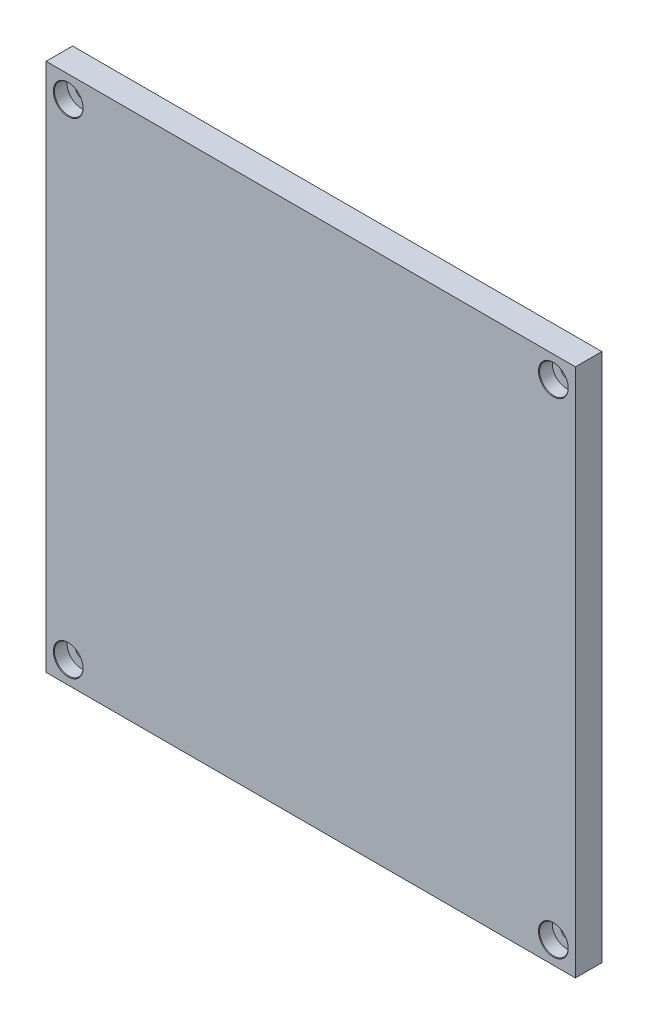
ISO-10303-21;
HEADER;
FILE_DESCRIPTION(('STEP AP214'),'2;1');
FILE_NAME('part.step','',(''),(''),'','','');
FILE_SCHEMA(('AUTOMOTIVE_DESIGN { 1 0 10303 214 1 1 1 1 }'));
ENDSEC;
DATA;
#1=APPLICATION_CONTEXT('core data for automotive mechanical design processes');
#2=APPLICATION_PROTOCOL_DEFINITION('international standard','automotive_design',2000,#1);
#3=PRODUCT_CONTEXT('',#1,'mechanical');
#4=PRODUCT('Part','Part','',(#3));
#5=PRODUCT_RELATED_PRODUCT_CATEGORY('part','',(#4));
#6=PRODUCT_DEFINITION_FORMATION('','',#4);
#7=PRODUCT_DEFINITION_CONTEXT('part definition',#1,'design');
#8=PRODUCT_DEFINITION('design','',#6,#7);
#9=PRODUCT_DEFINITION_SHAPE('','',#8);
#10=(LENGTH_UNIT() NAMED_UNIT(*) SI_UNIT(.MILLI.,.METRE.));
#11=(NAMED_UNIT(*) PLANE_ANGLE_UNIT() SI_UNIT($,.RADIAN.));
#12=(NAMED_UNIT(*) SI_UNIT($,.STERADIAN.) SOLID_ANGLE_UNIT());
#13=UNCERTAINTY_MEASURE_WITH_UNIT(LENGTH_MEASURE(1.E-05),#10,'distance_accuracy_value','');
#14=(GEOMETRIC_REPRESENTATION_CONTEXT(3) GLOBAL_UNCERTAINTY_ASSIGNED_CONTEXT((#13)) GLOBAL_UNIT_ASSIGNED_CONTEXT((#10,
#11,#12)) REPRESENTATION_CONTEXT('',''));
#15=CARTESIAN_POINT('',(0.,0.,0.));
#16=DIRECTION('',(0.,0.,1.));
#17=DIRECTION('',(1.,0.,0.));
#18=AXIS2_PLACEMENT_3D('',#15,#16,#17);
#19=CARTESIAN_POINT('',(60.,60.,6.));
#20=DIRECTION('',(0.,-1.,0.));
#21=DIRECTION('',(0.,0.,-1.));
#22=AXIS2_PLACEMENT_3D('',#19,#20,#21);
#23=PLANE('',#22);
#24=DIRECTION('',(-1.,0.,0.));
#25=VECTOR('',#24,1.);
#26=CARTESIAN_POINT('',(60.,60.,0.));
#27=LINE('',#26,#25);
#28=CARTESIAN_POINT('',(60.,60.,0.));
#29=VERTEX_POINT('',#28);
#30=CARTESIAN_POINT('',(-60.,60.,0.));
#31=VERTEX_POINT('',#30);
#32=EDGE_CURVE('E113',#29,#31,#27,.T.);
#33=ORIENTED_EDGE('',*,*,#32,.T.);
#34=DIRECTION('',(0.,0.,-1.));
#35=VECTOR('',#34,1.);
#36=CARTESIAN_POINT('',(-60.,60.,6.));
#37=LINE('',#36,#35);
#38=CARTESIAN_POINT('',(-60.,60.,6.));
#39=VERTEX_POINT('',#38);
#40=EDGE_CURVE('E11',#39,#31,#37,.T.);
#41=ORIENTED_EDGE('',*,*,#40,.F.);
#42=DIRECTION('',(-1.,0.,0.));
#43=VECTOR('',#42,1.);
#44=CARTESIAN_POINT('',(60.,60.,6.));
#45=LINE('',#44,#43);
#46=CARTESIAN_POINT('',(60.,60.,6.));
#47=VERTEX_POINT('',#46);
#48=EDGE_CURVE('E97',#47,#39,#45,.T.);
#49=ORIENTED_EDGE('',*,*,#48,.F.);
#50=DIRECTION('',(0.,0.,-1.));
#51=VECTOR('',#50,1.);
#52=CARTESIAN_POINT('',(60.,60.,6.));
#53=LINE('',#52,#51);
#54=EDGE_CURVE('E107',#47,#29,#53,.T.);
#55=ORIENTED_EDGE('',*,*,#54,.T.);
#56=EDGE_LOOP('',(#33,#41,#49,#55));
#57=FACE_BOUND('',#56,.T.);
#58=ADVANCED_FACE('F44',(#57),#23,.F.);
#59=CARTESIAN_POINT('',(-60.,-60.,6.));
#60=DIRECTION('',(1.,0.,0.));
#61=DIRECTION('',(0.,0.,-1.));
#62=AXIS2_PLACEMENT_3D('',#59,#60,#61);
#63=PLANE('',#62);
#64=DIRECTION('',(0.,-1.,0.));
#65=VECTOR('',#64,1.);
#66=CARTESIAN_POINT('',(-60.,-60.,0.));
#67=LINE('',#66,#65);
#68=CARTESIAN_POINT('',(-60.,-60.,0.));
#69=VERTEX_POINT('',#68);
#70=EDGE_CURVE('E105',#31,#69,#67,.T.);
#71=ORIENTED_EDGE('',*,*,#70,.T.);
#72=DIRECTION('',(0.,0.,-1.));
#73=VECTOR('',#72,1.);
#74=CARTESIAN_POINT('',(-60.,-60.,6.));
#75=LINE('',#74,#73);
#76=CARTESIAN_POINT('',(-60.,-60.,6.));
#77=VERTEX_POINT('',#76);
#78=EDGE_CURVE('E53',#77,#69,#75,.T.);
#79=ORIENTED_EDGE('',*,*,#78,.F.);
#80=DIRECTION('',(0.,-1.,0.));
#81=VECTOR('',#80,1.);
#82=CARTESIAN_POINT('',(-60.,-60.,6.));
#83=LINE('',#82,#81);
#84=EDGE_CURVE('E95',#39,#77,#83,.T.);
#85=ORIENTED_EDGE('',*,*,#84,.F.);
#86=ORIENTED_EDGE('',*,*,#40,.T.);
#87=EDGE_LOOP('',(#71,#79,#85,#86));
#88=FACE_BOUND('',#87,.T.);
#89=ADVANCED_FACE('F103',(#88),#63,.F.);
#90=CARTESIAN_POINT('',(60.,-60.,6.));
#91=DIRECTION('',(0.,1.,0.));
#92=DIRECTION('',(0.,0.,1.));
#93=AXIS2_PLACEMENT_3D('',#90,#91,#92);
#94=PLANE('',#93);
#95=DIRECTION('',(1.,0.,0.));
#96=VECTOR('',#95,1.);
#97=CARTESIAN_POINT('',(60.,-60.,0.));
#98=LINE('',#97,#96);
#99=CARTESIAN_POINT('',(60.,-60.,0.));
#100=VERTEX_POINT('',#99);
#101=EDGE_CURVE('E79',#69,#100,#98,.T.);
#102=ORIENTED_EDGE('',*,*,#101,.T.);
#103=DIRECTION('',(0.,0.,-1.));
#104=VECTOR('',#103,1.);
#105=CARTESIAN_POINT('',(60.,-60.,6.));
#106=LINE('',#105,#104);
#107=CARTESIAN_POINT('',(60.,-60.,6.));
#108=VERTEX_POINT('',#107);
#109=EDGE_CURVE('E104',#108,#100,#106,.T.);
#110=ORIENTED_EDGE('',*,*,#109,.F.);
#111=DIRECTION('',(1.,0.,0.));
#112=VECTOR('',#111,1.);
#113=CARTESIAN_POINT('',(60.,-60.,6.));
#114=LINE('',#113,#112);
#115=EDGE_CURVE('E93',#77,#108,#114,.T.);
#116=ORIENTED_EDGE('',*,*,#115,.F.);
#117=ORIENTED_EDGE('',*,*,#78,.T.);
#118=EDGE_LOOP('',(#102,#110,#116,#117));
#119=FACE_BOUND('',#118,.T.);
#120=ADVANCED_FACE('F102',(#119),#94,.F.);
#121=CARTESIAN_POINT('',(60.,-60.,6.));
#122=DIRECTION('',(-1.,0.,0.));
#123=DIRECTION('',(0.,0.,1.));
#124=AXIS2_PLACEMENT_3D('',#121,#122,#123);
#125=PLANE('',#124);
#126=DIRECTION('',(0.,1.,0.));
#127=VECTOR('',#126,1.);
#128=CARTESIAN_POINT('',(60.,-60.,0.));
#129=LINE('',#128,#127);
#130=EDGE_CURVE('E83',#100,#29,#129,.T.);
#131=ORIENTED_EDGE('',*,*,#130,.T.);
#132=ORIENTED_EDGE('',*,*,#54,.F.);
#133=DIRECTION('',(0.,1.,0.));
#134=VECTOR('',#133,1.);
#135=CARTESIAN_POINT('',(60.,-60.,6.));
#136=LINE('',#135,#134);
#137=EDGE_CURVE('E65',#108,#47,#136,.T.);
#138=ORIENTED_EDGE('',*,*,#137,.F.);
#139=ORIENTED_EDGE('',*,*,#109,.T.);
#140=EDGE_LOOP('',(#131,#132,#138,#139));
#141=FACE_BOUND('',#140,.T.);
#142=ADVANCED_FACE('F130',(#141),#125,.F.);
#143=CARTESIAN_POINT('',(0.,0.,6.));
#144=DIRECTION('',(0.,0.,-1.));
#145=DIRECTION('',(-1.,0.,0.));
#146=AXIS2_PLACEMENT_3D('',#143,#144,#145);
#147=PLANE('',#146);
#148=CARTESIAN_POINT('',(55.,-55.,6.));
#149=DIRECTION('',(0.,0.,1.));
#150=DIRECTION('',(1.,0.,0.));
#151=AXIS2_PLACEMENT_3D('',#148,#149,#150);
#152=CIRCLE('',#151,3.375);
#153=CARTESIAN_POINT('',(58.375,-55.,6.));
#154=VERTEX_POINT('',#153);
#155=EDGE_CURVE('E209',#154,#154,#152,.T.);
#156=ORIENTED_EDGE('',*,*,#155,.F.);
#157=EDGE_LOOP('',(#156));
#158=FACE_BOUND('',#157,.T.);
#159=CARTESIAN_POINT('',(55.,55.,6.));
#160=DIRECTION('',(0.,0.,1.));
#161=DIRECTION('',(1.,0.,0.));
#162=AXIS2_PLACEMENT_3D('',#159,#160,#161);
#163=CIRCLE('',#162,3.375);
#164=CARTESIAN_POINT('',(58.375,55.,6.));
#165=VERTEX_POINT('',#164);
#166=EDGE_CURVE('E186',#165,#165,#163,.T.);
#167=ORIENTED_EDGE('',*,*,#166,.F.);
#168=EDGE_LOOP('',(#167));
#169=FACE_BOUND('',#168,.T.);
#170=CARTESIAN_POINT('',(-55.,-55.,6.));
#171=DIRECTION('',(0.,0.,1.));
#172=DIRECTION('',(1.,0.,0.));
#173=AXIS2_PLACEMENT_3D('',#170,#171,#172);
#174=CIRCLE('',#173,3.375);
#175=CARTESIAN_POINT('',(-51.625,-55.,6.));
#176=VERTEX_POINT('',#175);
#177=EDGE_CURVE('E169',#176,#176,#174,.T.);
#178=ORIENTED_EDGE('',*,*,#177,.F.);
#179=EDGE_LOOP('',(#178));
#180=FACE_BOUND('',#179,.T.);
#181=CARTESIAN_POINT('',(-55.,55.,6.));
#182=DIRECTION('',(0.,0.,1.));
#183=DIRECTION('',(1.,0.,0.));
#184=AXIS2_PLACEMENT_3D('',#181,#182,#183);
#185=CIRCLE('',#184,3.375);
#186=CARTESIAN_POINT('',(-51.625,55.,6.));
#187=VERTEX_POINT('',#186);
#188=EDGE_CURVE('E146',#187,#187,#185,.T.);
#189=ORIENTED_EDGE('',*,*,#188,.F.);
#190=EDGE_LOOP('',(#189));
#191=FACE_BOUND('',#190,.T.);
#192=ORIENTED_EDGE('',*,*,#48,.T.);
#193=ORIENTED_EDGE('',*,*,#84,.T.);
#194=ORIENTED_EDGE('',*,*,#115,.T.);
#195=ORIENTED_EDGE('',*,*,#137,.T.);
#196=EDGE_LOOP('',(#192,#193,#194,#195));
#197=FACE_BOUND('',#196,.T.);
#198=ADVANCED_FACE('F94',(#158,#169,#180,#191,#197),#147,.F.);
#199=CARTESIAN_POINT('',(0.,0.,0.));
#200=DIRECTION('',(0.,0.,-1.));
#201=DIRECTION('',(-1.,0.,0.));
#202=AXIS2_PLACEMENT_3D('',#199,#200,#201);
#203=PLANE('',#202);
#204=CARTESIAN_POINT('',(55.,-55.,0.));
#205=DIRECTION('',(0.,0.,1.));
#206=DIRECTION('',(1.,0.,0.));
#207=AXIS2_PLACEMENT_3D('',#204,#205,#206);
#208=CIRCLE('',#207,1.25);
#209=CARTESIAN_POINT('',(56.25,-55.,0.));
#210=VERTEX_POINT('',#209);
#211=EDGE_CURVE('E194',#210,#210,#208,.T.);
#212=ORIENTED_EDGE('',*,*,#211,.T.);
#213=EDGE_LOOP('',(#212));
#214=FACE_BOUND('',#213,.T.);
#215=CARTESIAN_POINT('',(55.,55.,0.));
#216=DIRECTION('',(0.,0.,1.));
#217=DIRECTION('',(1.,0.,0.));
#218=AXIS2_PLACEMENT_3D('',#215,#216,#217);
#219=CIRCLE('',#218,1.25);
#220=CARTESIAN_POINT('',(56.25,55.,0.));
#221=VERTEX_POINT('',#220);
#222=EDGE_CURVE('E173',#221,#221,#219,.T.);
#223=ORIENTED_EDGE('',*,*,#222,.T.);
#224=EDGE_LOOP('',(#223));
#225=FACE_BOUND('',#224,.T.);
#226=CARTESIAN_POINT('',(-55.,-55.,0.));
#227=DIRECTION('',(0.,0.,1.));
#228=DIRECTION('',(1.,0.,0.));
#229=AXIS2_PLACEMENT_3D('',#226,#227,#228);
#230=CIRCLE('',#229,1.25);
#231=CARTESIAN_POINT('',(-53.75,-55.,0.));
#232=VERTEX_POINT('',#231);
#233=EDGE_CURVE('E151',#232,#232,#230,.T.);
#234=ORIENTED_EDGE('',*,*,#233,.T.);
#235=EDGE_LOOP('',(#234));
#236=FACE_BOUND('',#235,.T.);
#237=CARTESIAN_POINT('',(-55.,55.,0.));
#238=DIRECTION('',(0.,0.,1.));
#239=DIRECTION('',(1.,0.,0.));
#240=AXIS2_PLACEMENT_3D('',#237,#238,#239);
#241=CIRCLE('',#240,1.25);
#242=CARTESIAN_POINT('',(-53.75,55.,0.));
#243=VERTEX_POINT('',#242);
#244=EDGE_CURVE('E120',#243,#243,#241,.T.);
#245=ORIENTED_EDGE('',*,*,#244,.T.);
#246=EDGE_LOOP('',(#245));
#247=FACE_BOUND('',#246,.T.);
#248=ORIENTED_EDGE('',*,*,#32,.F.);
#249=ORIENTED_EDGE('',*,*,#130,.F.);
#250=ORIENTED_EDGE('',*,*,#101,.F.);
#251=ORIENTED_EDGE('',*,*,#70,.F.);
#252=EDGE_LOOP('',(#248,#249,#250,#251));
#253=FACE_BOUND('',#252,.T.);
#254=ADVANCED_FACE('F128',(#214,#225,#236,#247,#253),#203,.T.);
#255=CARTESIAN_POINT('',(-55.,55.,6.));
#256=DIRECTION('',(0.,0.,1.));
#257=DIRECTION('',(1.,0.,0.));
#258=AXIS2_PLACEMENT_3D('',#255,#256,#257);
#259=CYLINDRICAL_SURFACE('',#258,1.25);
#260=ORIENTED_EDGE('',*,*,#244,.F.);
#261=EDGE_LOOP('',(#260));
#262=FACE_BOUND('',#261,.T.);
#263=CARTESIAN_POINT('',(-55.,55.,3.));
#264=DIRECTION('',(0.,0.,1.));
#265=DIRECTION('',(1.,0.,0.));
#266=AXIS2_PLACEMENT_3D('',#263,#264,#265);
#267=CIRCLE('',#266,1.25);
#268=CARTESIAN_POINT('',(-53.75,55.,3.));
#269=VERTEX_POINT('',#268);
#270=EDGE_CURVE('E140',#269,#269,#267,.T.);
#271=ORIENTED_EDGE('',*,*,#270,.T.);
#272=EDGE_LOOP('',(#271));
#273=FACE_BOUND('',#272,.T.);
#274=ADVANCED_FACE('F251',(#262,#273),#259,.F.);
#275=CARTESIAN_POINT('',(-51.75,55.,3.));
#276=DIRECTION('',(0.,0.,-1.));
#277=DIRECTION('',(-1.,0.,0.));
#278=AXIS2_PLACEMENT_3D('',#275,#276,#277);
#279=PLANE('',#278);
#280=ORIENTED_EDGE('',*,*,#270,.F.);
#281=EDGE_LOOP('',(#280));
#282=FACE_BOUND('',#281,.T.);
#283=CARTESIAN_POINT('',(-55.,55.,3.));
#284=DIRECTION('',(0.,0.,1.));
#285=DIRECTION('',(1.,0.,0.));
#286=AXIS2_PLACEMENT_3D('',#283,#284,#285);
#287=CIRCLE('',#286,3.25);
#288=CARTESIAN_POINT('',(-51.75,55.,3.));
#289=VERTEX_POINT('',#288);
#290=EDGE_CURVE('E142',#289,#289,#287,.T.);
#291=ORIENTED_EDGE('',*,*,#290,.T.);
#292=EDGE_LOOP('',(#291));
#293=FACE_BOUND('',#292,.T.);
#294=ADVANCED_FACE('F238',(#282,#293),#279,.F.);
#295=CARTESIAN_POINT('',(-55.,55.,6.));
#296=DIRECTION('',(0.,0.,1.));
#297=DIRECTION('',(1.,0.,0.));
#298=AXIS2_PLACEMENT_3D('',#295,#296,#297);
#299=CYLINDRICAL_SURFACE('',#298,3.25);
#300=ORIENTED_EDGE('',*,*,#290,.F.);
#301=EDGE_LOOP('',(#300));
#302=FACE_BOUND('',#301,.T.);
#303=CARTESIAN_POINT('',(-55.,55.,5.875));
#304=DIRECTION('',(0.,0.,1.));
#305=DIRECTION('',(1.,0.,0.));
#306=AXIS2_PLACEMENT_3D('',#303,#304,#305);
#307=CIRCLE('',#306,3.25);
#308=CARTESIAN_POINT('',(-51.75,55.,5.875));
#309=VERTEX_POINT('',#308);
#310=EDGE_CURVE('E143',#309,#309,#307,.T.);
#311=ORIENTED_EDGE('',*,*,#310,.T.);
#312=EDGE_LOOP('',(#311));
#313=FACE_BOUND('',#312,.T.);
#314=ADVANCED_FACE('F226',(#302,#313),#299,.F.);
#315=CARTESIAN_POINT('',(-55.,55.,6.));
#316=DIRECTION('',(0.,0.,1.));
#317=DIRECTION('',(1.,0.,0.));
#318=AXIS2_PLACEMENT_3D('',#315,#316,#317);
#319=CONICAL_SURFACE('',#318,3.375,0.785398163397414);
#320=ORIENTED_EDGE('',*,*,#310,.F.);
#321=EDGE_LOOP('',(#320));
#322=FACE_BOUND('',#321,.T.);
#323=ORIENTED_EDGE('',*,*,#188,.T.);
#324=EDGE_LOOP('',(#323));
#325=FACE_BOUND('',#324,.T.);
#326=ADVANCED_FACE('F223',(#322,#325),#319,.F.);
#327=CARTESIAN_POINT('',(-55.,-55.,6.));
#328=DIRECTION('',(0.,0.,1.));
#329=DIRECTION('',(1.,0.,0.));
#330=AXIS2_PLACEMENT_3D('',#327,#328,#329);
#331=CYLINDRICAL_SURFACE('',#330,1.25);
#332=ORIENTED_EDGE('',*,*,#233,.F.);
#333=EDGE_LOOP('',(#332));
#334=FACE_BOUND('',#333,.T.);
#335=CARTESIAN_POINT('',(-55.,-55.,3.));
#336=DIRECTION('',(0.,0.,1.));
#337=DIRECTION('',(1.,0.,0.));
#338=AXIS2_PLACEMENT_3D('',#335,#336,#337);
#339=CIRCLE('',#338,1.25);
#340=CARTESIAN_POINT('',(-53.75,-55.,3.));
#341=VERTEX_POINT('',#340);
#342=EDGE_CURVE('E160',#341,#341,#339,.T.);
#343=ORIENTED_EDGE('',*,*,#342,.T.);
#344=EDGE_LOOP('',(#343));
#345=FACE_BOUND('',#344,.T.);
#346=ADVANCED_FACE('F227',(#334,#345),#331,.F.);
#347=CARTESIAN_POINT('',(-51.75,-55.,3.));
#348=DIRECTION('',(0.,0.,-1.));
#349=DIRECTION('',(-1.,0.,0.));
#350=AXIS2_PLACEMENT_3D('',#347,#348,#349);
#351=PLANE('',#350);
#352=ORIENTED_EDGE('',*,*,#342,.F.);
#353=EDGE_LOOP('',(#352));
#354=FACE_BOUND('',#353,.T.);
#355=CARTESIAN_POINT('',(-55.,-55.,3.));
#356=DIRECTION('',(0.,0.,1.));
#357=DIRECTION('',(1.,0.,0.));
#358=AXIS2_PLACEMENT_3D('',#355,#356,#357);
#359=CIRCLE('',#358,3.25);
#360=CARTESIAN_POINT('',(-51.75,-55.,3.));
#361=VERTEX_POINT('',#360);
#362=EDGE_CURVE('E163',#361,#361,#359,.T.);
#363=ORIENTED_EDGE('',*,*,#362,.T.);
#364=EDGE_LOOP('',(#363));
#365=FACE_BOUND('',#364,.T.);
#366=ADVANCED_FACE('F232',(#354,#365),#351,.F.);
#367=CARTESIAN_POINT('',(-55.,-55.,6.));
#368=DIRECTION('',(0.,0.,1.));
#369=DIRECTION('',(1.,0.,0.));
#370=AXIS2_PLACEMENT_3D('',#367,#368,#369);
#371=CYLINDRICAL_SURFACE('',#370,3.25);
#372=ORIENTED_EDGE('',*,*,#362,.F.);
#373=EDGE_LOOP('',(#372));
#374=FACE_BOUND('',#373,.T.);
#375=CARTESIAN_POINT('',(-55.,-55.,5.875));
#376=DIRECTION('',(0.,0.,1.));
#377=DIRECTION('',(1.,0.,0.));
#378=AXIS2_PLACEMENT_3D('',#375,#376,#377);
#379=CIRCLE('',#378,3.25);
#380=CARTESIAN_POINT('',(-51.75,-55.,5.875));
#381=VERTEX_POINT('',#380);
#382=EDGE_CURVE('E164',#381,#381,#379,.T.);
#383=ORIENTED_EDGE('',*,*,#382,.T.);
#384=EDGE_LOOP('',(#383));
#385=FACE_BOUND('',#384,.T.);
#386=ADVANCED_FACE('F298',(#374,#385),#371,.F.);
#387=CARTESIAN_POINT('',(-55.,-55.,6.));
#388=DIRECTION('',(0.,0.,1.));
#389=DIRECTION('',(1.,0.,0.));
#390=AXIS2_PLACEMENT_3D('',#387,#388,#389);
#391=CONICAL_SURFACE('',#390,3.375,0.785398163397414);
#392=ORIENTED_EDGE('',*,*,#382,.F.);
#393=EDGE_LOOP('',(#392));
#394=FACE_BOUND('',#393,.T.);
#395=ORIENTED_EDGE('',*,*,#177,.T.);
#396=EDGE_LOOP('',(#395));
#397=FACE_BOUND('',#396,.T.);
#398=ADVANCED_FACE('F306',(#394,#397),#391,.F.);
#399=CARTESIAN_POINT('',(55.,55.,6.));
#400=DIRECTION('',(0.,0.,1.));
#401=DIRECTION('',(1.,0.,0.));
#402=AXIS2_PLACEMENT_3D('',#399,#400,#401);
#403=CYLINDRICAL_SURFACE('',#402,1.25);
#404=ORIENTED_EDGE('',*,*,#222,.F.);
#405=EDGE_LOOP('',(#404));
#406=FACE_BOUND('',#405,.T.);
#407=CARTESIAN_POINT('',(55.,55.,3.));
#408=DIRECTION('',(0.,0.,1.));
#409=DIRECTION('',(1.,0.,0.));
#410=AXIS2_PLACEMENT_3D('',#407,#408,#409);
#411=CIRCLE('',#410,1.25);
#412=CARTESIAN_POINT('',(56.25,55.,3.));
#413=VERTEX_POINT('',#412);
#414=EDGE_CURVE('E180',#413,#413,#411,.T.);
#415=ORIENTED_EDGE('',*,*,#414,.T.);
#416=EDGE_LOOP('',(#415));
#417=FACE_BOUND('',#416,.T.);
#418=ADVANCED_FACE('F317',(#406,#417),#403,.F.);
#419=CARTESIAN_POINT('',(58.25,55.,3.));
#420=DIRECTION('',(0.,0.,-1.));
#421=DIRECTION('',(-1.,0.,0.));
#422=AXIS2_PLACEMENT_3D('',#419,#420,#421);
#423=PLANE('',#422);
#424=ORIENTED_EDGE('',*,*,#414,.F.);
#425=EDGE_LOOP('',(#424));
#426=FACE_BOUND('',#425,.T.);
#427=CARTESIAN_POINT('',(55.,55.,3.));
#428=DIRECTION('',(0.,0.,1.));
#429=DIRECTION('',(1.,0.,0.));
#430=AXIS2_PLACEMENT_3D('',#427,#428,#429);
#431=CIRCLE('',#430,3.25);
#432=CARTESIAN_POINT('',(58.25,55.,3.));
#433=VERTEX_POINT('',#432);
#434=EDGE_CURVE('E181',#433,#433,#431,.T.);
#435=ORIENTED_EDGE('',*,*,#434,.T.);
#436=EDGE_LOOP('',(#435));
#437=FACE_BOUND('',#436,.T.);
#438=ADVANCED_FACE('F328',(#426,#437),#423,.F.);
#439=CARTESIAN_POINT('',(55.,55.,6.));
#440=DIRECTION('',(0.,0.,1.));
#441=DIRECTION('',(1.,0.,0.));
#442=AXIS2_PLACEMENT_3D('',#439,#440,#441);
#443=CYLINDRICAL_SURFACE('',#442,3.25);
#444=ORIENTED_EDGE('',*,*,#434,.F.);
#445=EDGE_LOOP('',(#444));
#446=FACE_BOUND('',#445,.T.);
#447=CARTESIAN_POINT('',(55.,55.,5.875));
#448=DIRECTION('',(0.,0.,1.));
#449=DIRECTION('',(1.,0.,0.));
#450=AXIS2_PLACEMENT_3D('',#447,#448,#449);
#451=CIRCLE('',#450,3.25);
#452=CARTESIAN_POINT('',(58.25,55.,5.875));
#453=VERTEX_POINT('',#452);
#454=EDGE_CURVE('E184',#453,#453,#451,.T.);
#455=ORIENTED_EDGE('',*,*,#454,.T.);
#456=EDGE_LOOP('',(#455));
#457=FACE_BOUND('',#456,.T.);
#458=ADVANCED_FACE('F337',(#446,#457),#443,.F.);
#459=CARTESIAN_POINT('',(55.,55.,6.));
#460=DIRECTION('',(0.,0.,1.));
#461=DIRECTION('',(1.,0.,0.));
#462=AXIS2_PLACEMENT_3D('',#459,#460,#461);
#463=CONICAL_SURFACE('',#462,3.375,0.785398163397414);
#464=ORIENTED_EDGE('',*,*,#454,.F.);
#465=EDGE_LOOP('',(#464));
#466=FACE_BOUND('',#465,.T.);
#467=ORIENTED_EDGE('',*,*,#166,.T.);
#468=EDGE_LOOP('',(#467));
#469=FACE_BOUND('',#468,.T.);
#470=ADVANCED_FACE('F348',(#466,#469),#463,.F.);
#471=CARTESIAN_POINT('',(55.,-55.,6.));
#472=DIRECTION('',(0.,0.,1.));
#473=DIRECTION('',(1.,0.,0.));
#474=AXIS2_PLACEMENT_3D('',#471,#472,#473);
#475=CYLINDRICAL_SURFACE('',#474,1.25);
#476=ORIENTED_EDGE('',*,*,#211,.F.);
#477=EDGE_LOOP('',(#476));
#478=FACE_BOUND('',#477,.T.);
#479=CARTESIAN_POINT('',(55.,-55.,3.));
#480=DIRECTION('',(0.,0.,1.));
#481=DIRECTION('',(1.,0.,0.));
#482=AXIS2_PLACEMENT_3D('',#479,#480,#481);
#483=CIRCLE('',#482,1.25);
#484=CARTESIAN_POINT('',(56.25,-55.,3.));
#485=VERTEX_POINT('',#484);
#486=EDGE_CURVE('E200',#485,#485,#483,.T.);
#487=ORIENTED_EDGE('',*,*,#486,.T.);
#488=EDGE_LOOP('',(#487));
#489=FACE_BOUND('',#488,.T.);
#490=ADVANCED_FACE('F358',(#478,#489),#475,.F.);
#491=CARTESIAN_POINT('',(58.25,-55.,3.));
#492=DIRECTION('',(0.,0.,-1.));
#493=DIRECTION('',(-1.,0.,0.));
#494=AXIS2_PLACEMENT_3D('',#491,#492,#493);
#495=PLANE('',#494);
#496=ORIENTED_EDGE('',*,*,#486,.F.);
#497=EDGE_LOOP('',(#496));
#498=FACE_BOUND('',#497,.T.);
#499=CARTESIAN_POINT('',(55.,-55.,3.));
#500=DIRECTION('',(0.,0.,1.));
#501=DIRECTION('',(1.,0.,0.));
#502=AXIS2_PLACEMENT_3D('',#499,#500,#501);
#503=CIRCLE('',#502,3.25);
#504=CARTESIAN_POINT('',(58.25,-55.,3.));
#505=VERTEX_POINT('',#504);
#506=EDGE_CURVE('E202',#505,#505,#503,.T.);
#507=ORIENTED_EDGE('',*,*,#506,.T.);
#508=EDGE_LOOP('',(#507));
#509=FACE_BOUND('',#508,.T.);
#510=ADVANCED_FACE('F366',(#498,#509),#495,.F.);
#511=CARTESIAN_POINT('',(55.,-55.,6.));
#512=DIRECTION('',(0.,0.,1.));
#513=DIRECTION('',(1.,0.,0.));
#514=AXIS2_PLACEMENT_3D('',#511,#512,#513);
#515=CYLINDRICAL_SURFACE('',#514,3.25);
#516=ORIENTED_EDGE('',*,*,#506,.F.);
#517=EDGE_LOOP('',(#516));
#518=FACE_BOUND('',#517,.T.);
#519=CARTESIAN_POINT('',(55.,-55.,5.875));
#520=DIRECTION('',(0.,0.,1.));
#521=DIRECTION('',(1.,0.,0.));
#522=AXIS2_PLACEMENT_3D('',#519,#520,#521);
#523=CIRCLE('',#522,3.25);
#524=CARTESIAN_POINT('',(58.25,-55.,5.875));
#525=VERTEX_POINT('',#524);
#526=EDGE_CURVE('E203',#525,#525,#523,.T.);
#527=ORIENTED_EDGE('',*,*,#526,.T.);
#528=EDGE_LOOP('',(#527));
#529=FACE_BOUND('',#528,.T.);
#530=ADVANCED_FACE('F376',(#518,#529),#515,.F.);
#531=CARTESIAN_POINT('',(55.,-55.,6.));
#532=DIRECTION('',(0.,0.,1.));
#533=DIRECTION('',(1.,0.,0.));
#534=AXIS2_PLACEMENT_3D('',#531,#532,#533);
#535=CONICAL_SURFACE('',#534,3.375,0.785398163397414);
#536=ORIENTED_EDGE('',*,*,#526,.F.);
#537=EDGE_LOOP('',(#536));
#538=FACE_BOUND('',#537,.T.);
#539=ORIENTED_EDGE('',*,*,#155,.T.);
#540=EDGE_LOOP('',(#539));
#541=FACE_BOUND('',#540,.T.);
#542=ADVANCED_FACE('F211',(#538,#541),#535,.F.);
#543=CLOSED_SHELL('',(#58,#89,#120,#142,#198,#254,#274,#294,#314,#326,#346,#366,#386,#398,#418,
#438,#458,#470,#490,#510,#530,#542));
#544=MANIFOLD_SOLID_BREP('B2',#543);
#545=ADVANCED_BREP_SHAPE_REPRESENTATION('',(#18,#544),#14);
#546=SHAPE_DEFINITION_REPRESENTATION(#9,#545);
ENDSEC;
END-ISO-10303-21;
